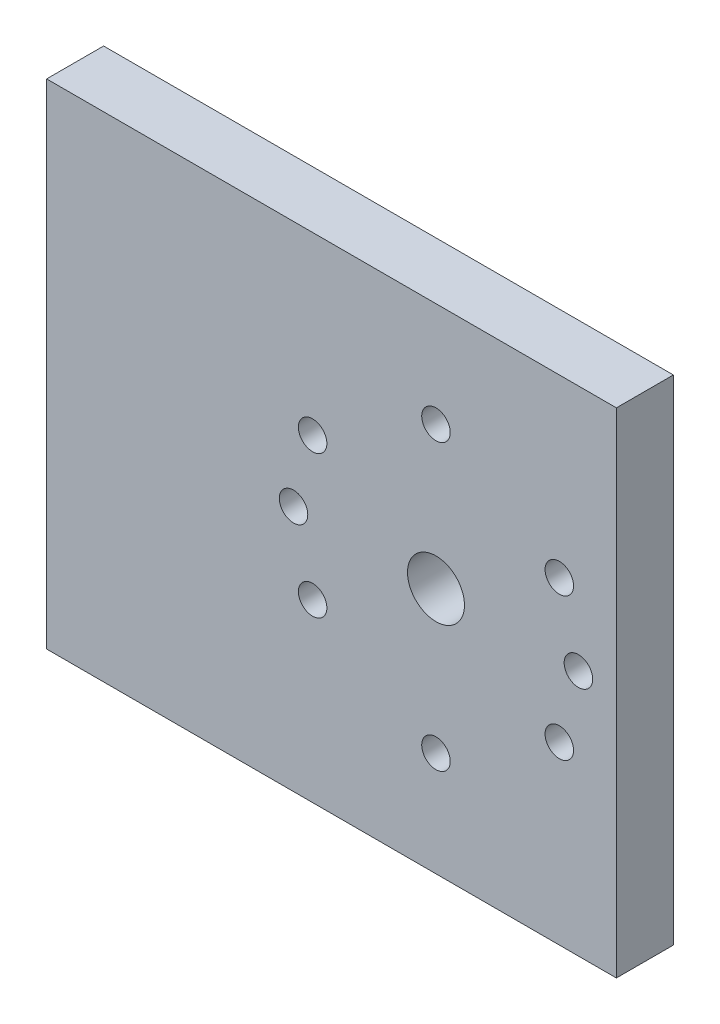
ISO-10303-21;
HEADER;
FILE_DESCRIPTION(('STEP AP214'),'2;1');
FILE_NAME('part.step','',(''),(''),'','','');
FILE_SCHEMA(('AUTOMOTIVE_DESIGN { 1 0 10303 214 1 1 1 1 }'));
ENDSEC;
DATA;
#1=APPLICATION_CONTEXT('core data for automotive mechanical design processes');
#2=APPLICATION_PROTOCOL_DEFINITION('international standard','automotive_design',2000,#1);
#3=PRODUCT_CONTEXT('',#1,'mechanical');
#4=PRODUCT('Part','Part','',(#3));
#5=PRODUCT_RELATED_PRODUCT_CATEGORY('part','',(#4));
#6=PRODUCT_DEFINITION_FORMATION('','',#4);
#7=PRODUCT_DEFINITION_CONTEXT('part definition',#1,'design');
#8=PRODUCT_DEFINITION('design','',#6,#7);
#9=PRODUCT_DEFINITION_SHAPE('','',#8);
#10=(LENGTH_UNIT() NAMED_UNIT(*) SI_UNIT(.MILLI.,.METRE.));
#11=(NAMED_UNIT(*) PLANE_ANGLE_UNIT() SI_UNIT($,.RADIAN.));
#12=(NAMED_UNIT(*) SI_UNIT($,.STERADIAN.) SOLID_ANGLE_UNIT());
#13=UNCERTAINTY_MEASURE_WITH_UNIT(LENGTH_MEASURE(1.E-05),#10,'distance_accuracy_value','');
#14=(GEOMETRIC_REPRESENTATION_CONTEXT(3) GLOBAL_UNCERTAINTY_ASSIGNED_CONTEXT((#13)) GLOBAL_UNIT_ASSIGNED_CONTEXT((#10,
#11,#12)) REPRESENTATION_CONTEXT('',''));
#15=CARTESIAN_POINT('',(0.,0.,0.));
#16=DIRECTION('',(0.,0.,1.));
#17=DIRECTION('',(1.,0.,0.));
#18=AXIS2_PLACEMENT_3D('',#15,#16,#17);
#19=CARTESIAN_POINT('',(0.,0.,3.));
#20=DIRECTION('',(0.,0.,1.));
#21=DIRECTION('',(1.,0.,0.));
#22=AXIS2_PLACEMENT_3D('',#19,#20,#21);
#23=PLANE('',#22);
#24=CARTESIAN_POINT('',(14.0048094716167,-16.7500000000001,3.));
#25=DIRECTION('',(0.,0.,1.));
#26=DIRECTION('',(1.,0.,0.));
#27=AXIS2_PLACEMENT_3D('',#24,#25,#26);
#28=CIRCLE('',#27,0.750000000000002);
#29=CARTESIAN_POINT('',(14.7548094716167,-16.7500000000001,3.));
#30=VERTEX_POINT('',#29);
#31=EDGE_CURVE('E151',#30,#30,#28,.T.);
#32=ORIENTED_EDGE('',*,*,#31,.F.);
#33=EDGE_LOOP('',(#32));
#34=FACE_BOUND('',#33,.T.);
#35=CARTESIAN_POINT('',(26.9951905283833,-16.7500000000001,3.));
#36=DIRECTION('',(0.,0.,1.));
#37=DIRECTION('',(1.,0.,0.));
#38=AXIS2_PLACEMENT_3D('',#35,#36,#37);
#39=CIRCLE('',#38,0.750000000000005);
#40=CARTESIAN_POINT('',(27.7451905283833,-16.7500000000001,3.));
#41=VERTEX_POINT('',#40);
#42=EDGE_CURVE('E139',#41,#41,#39,.T.);
#43=ORIENTED_EDGE('',*,*,#42,.F.);
#44=EDGE_LOOP('',(#43));
#45=FACE_BOUND('',#44,.T.);
#46=CARTESIAN_POINT('',(20.5,-13.0000000000001,3.));
#47=DIRECTION('',(0.,0.,1.));
#48=DIRECTION('',(1.,0.,0.));
#49=AXIS2_PLACEMENT_3D('',#46,#47,#48);
#50=CIRCLE('',#49,1.5);
#51=CARTESIAN_POINT('',(22.,-13.0000000000001,3.));
#52=VERTEX_POINT('',#51);
#53=EDGE_CURVE('E127',#52,#52,#50,.T.);
#54=ORIENTED_EDGE('',*,*,#53,.F.);
#55=EDGE_LOOP('',(#54));
#56=FACE_BOUND('',#55,.T.);
#57=CARTESIAN_POINT('',(28.,-13.0000000000001,3.));
#58=DIRECTION('',(0.,0.,1.));
#59=DIRECTION('',(1.,0.,0.));
#60=AXIS2_PLACEMENT_3D('',#57,#58,#59);
#61=CIRCLE('',#60,0.750000000000002);
#62=CARTESIAN_POINT('',(28.75,-13.0000000000001,3.));
#63=VERTEX_POINT('',#62);
#64=EDGE_CURVE('E115',#63,#63,#61,.T.);
#65=ORIENTED_EDGE('',*,*,#64,.F.);
#66=EDGE_LOOP('',(#65));
#67=FACE_BOUND('',#66,.T.);
#68=DIRECTION('',(0.,1.,0.));
#69=VECTOR('',#68,1.);
#70=CARTESIAN_POINT('',(30.,0.,3.));
#71=LINE('',#70,#69);
#72=CARTESIAN_POINT('',(30.,-26.,3.));
#73=VERTEX_POINT('',#72);
#74=CARTESIAN_POINT('',(30.,0.,3.));
#75=VERTEX_POINT('',#74);
#76=EDGE_CURVE('E85',#73,#75,#71,.T.);
#77=ORIENTED_EDGE('',*,*,#76,.T.);
#78=DIRECTION('',(-1.,0.,0.));
#79=VECTOR('',#78,1.);
#80=CARTESIAN_POINT('',(0.,0.,3.));
#81=LINE('',#80,#79);
#82=CARTESIAN_POINT('',(0.,0.,3.));
#83=VERTEX_POINT('',#82);
#84=EDGE_CURVE('E80',#75,#83,#81,.T.);
#85=ORIENTED_EDGE('',*,*,#84,.T.);
#86=DIRECTION('',(0.,-1.,0.));
#87=VECTOR('',#86,1.);
#88=CARTESIAN_POINT('',(0.,0.,3.));
#89=LINE('',#88,#87);
#90=CARTESIAN_POINT('',(0.,-26.0000000000002,3.));
#91=VERTEX_POINT('',#90);
#92=EDGE_CURVE('E83',#83,#91,#89,.T.);
#93=ORIENTED_EDGE('',*,*,#92,.T.);
#94=DIRECTION('',(1.,0.,0.));
#95=VECTOR('',#94,1.);
#96=CARTESIAN_POINT('',(0.,-26.0000000000002,3.));
#97=LINE('',#96,#95);
#98=EDGE_CURVE('E50',#91,#73,#97,.T.);
#99=ORIENTED_EDGE('',*,*,#98,.T.);
#100=EDGE_LOOP('',(#77,#85,#93,#99));
#101=FACE_BOUND('',#100,.T.);
#102=CARTESIAN_POINT('',(13.,-13.0000000000001,3.));
#103=DIRECTION('',(0.,0.,1.));
#104=DIRECTION('',(1.,0.,0.));
#105=AXIS2_PLACEMENT_3D('',#102,#103,#104);
#106=CIRCLE('',#105,0.75);
#107=CARTESIAN_POINT('',(13.75,-13.0000000000001,3.));
#108=VERTEX_POINT('',#107);
#109=EDGE_CURVE('E100',#108,#108,#106,.T.);
#110=ORIENTED_EDGE('',*,*,#109,.F.);
#111=EDGE_LOOP('',(#110));
#112=FACE_BOUND('',#111,.T.);
#113=CARTESIAN_POINT('',(20.5,-5.50000000000007,3.));
#114=DIRECTION('',(0.,0.,1.));
#115=DIRECTION('',(1.,0.,0.));
#116=AXIS2_PLACEMENT_3D('',#113,#114,#115);
#117=CIRCLE('',#116,0.750000000000002);
#118=CARTESIAN_POINT('',(21.25,-5.50000000000007,3.));
#119=VERTEX_POINT('',#118);
#120=EDGE_CURVE('E121',#119,#119,#117,.T.);
#121=ORIENTED_EDGE('',*,*,#120,.F.);
#122=EDGE_LOOP('',(#121));
#123=FACE_BOUND('',#122,.T.);
#124=CARTESIAN_POINT('',(26.9951905283833,-9.25000000000007,3.));
#125=DIRECTION('',(0.,0.,1.));
#126=DIRECTION('',(1.,0.,0.));
#127=AXIS2_PLACEMENT_3D('',#124,#125,#126);
#128=CIRCLE('',#127,0.750000000000002);
#129=CARTESIAN_POINT('',(27.7451905283833,-9.25000000000007,3.));
#130=VERTEX_POINT('',#129);
#131=EDGE_CURVE('E133',#130,#130,#128,.T.);
#132=ORIENTED_EDGE('',*,*,#131,.F.);
#133=EDGE_LOOP('',(#132));
#134=FACE_BOUND('',#133,.T.);
#135=CARTESIAN_POINT('',(20.5,-20.5000000000001,3.));
#136=DIRECTION('',(0.,0.,1.));
#137=DIRECTION('',(1.,0.,0.));
#138=AXIS2_PLACEMENT_3D('',#135,#136,#137);
#139=CIRCLE('',#138,0.750000000000002);
#140=CARTESIAN_POINT('',(21.25,-20.5000000000001,3.));
#141=VERTEX_POINT('',#140);
#142=EDGE_CURVE('E145',#141,#141,#139,.T.);
#143=ORIENTED_EDGE('',*,*,#142,.F.);
#144=EDGE_LOOP('',(#143));
#145=FACE_BOUND('',#144,.T.);
#146=CARTESIAN_POINT('',(14.0048094716167,-9.25000000000008,3.));
#147=DIRECTION('',(0.,0.,1.));
#148=DIRECTION('',(1.,0.,0.));
#149=AXIS2_PLACEMENT_3D('',#146,#147,#148);
#150=CIRCLE('',#149,0.750000000000002);
#151=CARTESIAN_POINT('',(14.7548094716167,-9.25000000000008,3.));
#152=VERTEX_POINT('',#151);
#153=EDGE_CURVE('E157',#152,#152,#150,.T.);
#154=ORIENTED_EDGE('',*,*,#153,.F.);
#155=EDGE_LOOP('',(#154));
#156=FACE_BOUND('',#155,.T.);
#157=ADVANCED_FACE('F33',(#34,#45,#56,#67,#101,#112,#123,#134,#145,#156),#23,.T.);
#158=CARTESIAN_POINT('',(0.,0.,0.));
#159=DIRECTION('',(0.,0.,1.));
#160=DIRECTION('',(1.,0.,0.));
#161=AXIS2_PLACEMENT_3D('',#158,#159,#160);
#162=PLANE('',#161);
#163=DIRECTION('',(0.,1.,0.));
#164=VECTOR('',#163,1.);
#165=CARTESIAN_POINT('',(30.,0.,0.));
#166=LINE('',#165,#164);
#167=CARTESIAN_POINT('',(30.,-26.,0.));
#168=VERTEX_POINT('',#167);
#169=CARTESIAN_POINT('',(30.,0.,0.));
#170=VERTEX_POINT('',#169);
#171=EDGE_CURVE('E97',#168,#170,#166,.T.);
#172=ORIENTED_EDGE('',*,*,#171,.F.);
#173=DIRECTION('',(1.,0.,0.));
#174=VECTOR('',#173,1.);
#175=CARTESIAN_POINT('',(0.,-26.0000000000002,0.));
#176=LINE('',#175,#174);
#177=CARTESIAN_POINT('',(0.,-26.0000000000002,0.));
#178=VERTEX_POINT('',#177);
#179=EDGE_CURVE('E73',#178,#168,#176,.T.);
#180=ORIENTED_EDGE('',*,*,#179,.F.);
#181=DIRECTION('',(0.,-1.,0.));
#182=VECTOR('',#181,1.);
#183=CARTESIAN_POINT('',(0.,0.,0.));
#184=LINE('',#183,#182);
#185=CARTESIAN_POINT('',(0.,0.,0.));
#186=VERTEX_POINT('',#185);
#187=EDGE_CURVE('E67',#186,#178,#184,.T.);
#188=ORIENTED_EDGE('',*,*,#187,.F.);
#189=DIRECTION('',(-1.,0.,0.));
#190=VECTOR('',#189,1.);
#191=CARTESIAN_POINT('',(0.,0.,0.));
#192=LINE('',#191,#190);
#193=EDGE_CURVE('E89',#170,#186,#192,.T.);
#194=ORIENTED_EDGE('',*,*,#193,.F.);
#195=EDGE_LOOP('',(#172,#180,#188,#194));
#196=FACE_BOUND('',#195,.T.);
#197=CARTESIAN_POINT('',(13.,-13.0000000000001,0.));
#198=DIRECTION('',(0.,0.,1.));
#199=DIRECTION('',(1.,0.,0.));
#200=AXIS2_PLACEMENT_3D('',#197,#198,#199);
#201=CIRCLE('',#200,0.75);
#202=CARTESIAN_POINT('',(13.75,-13.0000000000001,0.));
#203=VERTEX_POINT('',#202);
#204=EDGE_CURVE('E112',#203,#203,#201,.T.);
#205=ORIENTED_EDGE('',*,*,#204,.T.);
#206=EDGE_LOOP('',(#205));
#207=FACE_BOUND('',#206,.T.);
#208=CARTESIAN_POINT('',(28.,-13.0000000000001,0.));
#209=DIRECTION('',(0.,0.,1.));
#210=DIRECTION('',(1.,0.,0.));
#211=AXIS2_PLACEMENT_3D('',#208,#209,#210);
#212=CIRCLE('',#211,0.750000000000002);
#213=CARTESIAN_POINT('',(28.75,-13.0000000000001,0.));
#214=VERTEX_POINT('',#213);
#215=EDGE_CURVE('E118',#214,#214,#212,.T.);
#216=ORIENTED_EDGE('',*,*,#215,.T.);
#217=EDGE_LOOP('',(#216));
#218=FACE_BOUND('',#217,.T.);
#219=CARTESIAN_POINT('',(20.5,-5.50000000000007,0.));
#220=DIRECTION('',(0.,0.,1.));
#221=DIRECTION('',(1.,0.,0.));
#222=AXIS2_PLACEMENT_3D('',#219,#220,#221);
#223=CIRCLE('',#222,0.750000000000002);
#224=CARTESIAN_POINT('',(21.25,-5.50000000000007,0.));
#225=VERTEX_POINT('',#224);
#226=EDGE_CURVE('E124',#225,#225,#223,.T.);
#227=ORIENTED_EDGE('',*,*,#226,.T.);
#228=EDGE_LOOP('',(#227));
#229=FACE_BOUND('',#228,.T.);
#230=CARTESIAN_POINT('',(20.5,-13.0000000000001,0.));
#231=DIRECTION('',(0.,0.,1.));
#232=DIRECTION('',(1.,0.,0.));
#233=AXIS2_PLACEMENT_3D('',#230,#231,#232);
#234=CIRCLE('',#233,1.5);
#235=CARTESIAN_POINT('',(22.,-13.0000000000001,0.));
#236=VERTEX_POINT('',#235);
#237=EDGE_CURVE('E130',#236,#236,#234,.T.);
#238=ORIENTED_EDGE('',*,*,#237,.T.);
#239=EDGE_LOOP('',(#238));
#240=FACE_BOUND('',#239,.T.);
#241=CARTESIAN_POINT('',(26.9951905283833,-9.25000000000007,0.));
#242=DIRECTION('',(0.,0.,1.));
#243=DIRECTION('',(1.,0.,0.));
#244=AXIS2_PLACEMENT_3D('',#241,#242,#243);
#245=CIRCLE('',#244,0.750000000000002);
#246=CARTESIAN_POINT('',(27.7451905283833,-9.25000000000007,0.));
#247=VERTEX_POINT('',#246);
#248=EDGE_CURVE('E136',#247,#247,#245,.T.);
#249=ORIENTED_EDGE('',*,*,#248,.T.);
#250=EDGE_LOOP('',(#249));
#251=FACE_BOUND('',#250,.T.);
#252=CARTESIAN_POINT('',(26.9951905283833,-16.7500000000001,0.));
#253=DIRECTION('',(0.,0.,1.));
#254=DIRECTION('',(1.,0.,0.));
#255=AXIS2_PLACEMENT_3D('',#252,#253,#254);
#256=CIRCLE('',#255,0.750000000000005);
#257=CARTESIAN_POINT('',(27.7451905283833,-16.7500000000001,0.));
#258=VERTEX_POINT('',#257);
#259=EDGE_CURVE('E142',#258,#258,#256,.T.);
#260=ORIENTED_EDGE('',*,*,#259,.T.);
#261=EDGE_LOOP('',(#260));
#262=FACE_BOUND('',#261,.T.);
#263=CARTESIAN_POINT('',(20.5,-20.5000000000001,0.));
#264=DIRECTION('',(0.,0.,1.));
#265=DIRECTION('',(1.,0.,0.));
#266=AXIS2_PLACEMENT_3D('',#263,#264,#265);
#267=CIRCLE('',#266,0.750000000000002);
#268=CARTESIAN_POINT('',(21.25,-20.5000000000001,0.));
#269=VERTEX_POINT('',#268);
#270=EDGE_CURVE('E148',#269,#269,#267,.T.);
#271=ORIENTED_EDGE('',*,*,#270,.T.);
#272=EDGE_LOOP('',(#271));
#273=FACE_BOUND('',#272,.T.);
#274=CARTESIAN_POINT('',(14.0048094716167,-16.7500000000001,0.));
#275=DIRECTION('',(0.,0.,1.));
#276=DIRECTION('',(1.,0.,0.));
#277=AXIS2_PLACEMENT_3D('',#274,#275,#276);
#278=CIRCLE('',#277,0.750000000000002);
#279=CARTESIAN_POINT('',(14.7548094716167,-16.7500000000001,0.));
#280=VERTEX_POINT('',#279);
#281=EDGE_CURVE('E154',#280,#280,#278,.T.);
#282=ORIENTED_EDGE('',*,*,#281,.T.);
#283=EDGE_LOOP('',(#282));
#284=FACE_BOUND('',#283,.T.);
#285=CARTESIAN_POINT('',(14.0048094716167,-9.25000000000008,0.));
#286=DIRECTION('',(0.,0.,1.));
#287=DIRECTION('',(1.,0.,0.));
#288=AXIS2_PLACEMENT_3D('',#285,#286,#287);
#289=CIRCLE('',#288,0.750000000000002);
#290=CARTESIAN_POINT('',(14.7548094716167,-9.25000000000008,0.));
#291=VERTEX_POINT('',#290);
#292=EDGE_CURVE('E160',#291,#291,#289,.T.);
#293=ORIENTED_EDGE('',*,*,#292,.T.);
#294=EDGE_LOOP('',(#293));
#295=FACE_BOUND('',#294,.T.);
#296=ADVANCED_FACE('F108',(#196,#207,#218,#229,#240,#251,#262,#273,#284,#295),#162,.F.);
#297=CARTESIAN_POINT('',(30.,0.,3.));
#298=DIRECTION('',(-1.,0.,0.));
#299=DIRECTION('',(0.,-1.,0.));
#300=AXIS2_PLACEMENT_3D('',#297,#298,#299);
#301=PLANE('',#300);
#302=ORIENTED_EDGE('',*,*,#171,.T.);
#303=DIRECTION('',(0.,0.,-1.));
#304=VECTOR('',#303,1.);
#305=CARTESIAN_POINT('',(30.,0.,3.));
#306=LINE('',#305,#304);
#307=EDGE_CURVE('E11',#75,#170,#306,.T.);
#308=ORIENTED_EDGE('',*,*,#307,.F.);
#309=ORIENTED_EDGE('',*,*,#76,.F.);
#310=DIRECTION('',(0.,0.,-1.));
#311=VECTOR('',#310,1.);
#312=CARTESIAN_POINT('',(30.,-26.,3.));
#313=LINE('',#312,#311);
#314=EDGE_CURVE('E93',#73,#168,#313,.T.);
#315=ORIENTED_EDGE('',*,*,#314,.T.);
#316=EDGE_LOOP('',(#302,#308,#309,#315));
#317=FACE_BOUND('',#316,.T.);
#318=ADVANCED_FACE('F35',(#317),#301,.F.);
#319=CARTESIAN_POINT('',(0.,0.,3.));
#320=DIRECTION('',(0.,-1.,0.));
#321=DIRECTION('',(1.,0.,0.));
#322=AXIS2_PLACEMENT_3D('',#319,#320,#321);
#323=PLANE('',#322);
#324=ORIENTED_EDGE('',*,*,#193,.T.);
#325=DIRECTION('',(0.,0.,-1.));
#326=VECTOR('',#325,1.);
#327=CARTESIAN_POINT('',(0.,0.,3.));
#328=LINE('',#327,#326);
#329=EDGE_CURVE('E42',#83,#186,#328,.T.);
#330=ORIENTED_EDGE('',*,*,#329,.F.);
#331=ORIENTED_EDGE('',*,*,#84,.F.);
#332=ORIENTED_EDGE('',*,*,#307,.T.);
#333=EDGE_LOOP('',(#324,#330,#331,#332));
#334=FACE_BOUND('',#333,.T.);
#335=ADVANCED_FACE('F88',(#334),#323,.F.);
#336=CARTESIAN_POINT('',(0.,0.,3.));
#337=DIRECTION('',(1.,0.,0.));
#338=DIRECTION('',(0.,1.,0.));
#339=AXIS2_PLACEMENT_3D('',#336,#337,#338);
#340=PLANE('',#339);
#341=ORIENTED_EDGE('',*,*,#187,.T.);
#342=DIRECTION('',(0.,0.,-1.));
#343=VECTOR('',#342,1.);
#344=CARTESIAN_POINT('',(0.,-26.0000000000002,3.));
#345=LINE('',#344,#343);
#346=EDGE_CURVE('E90',#91,#178,#345,.T.);
#347=ORIENTED_EDGE('',*,*,#346,.F.);
#348=ORIENTED_EDGE('',*,*,#92,.F.);
#349=ORIENTED_EDGE('',*,*,#329,.T.);
#350=EDGE_LOOP('',(#341,#347,#348,#349));
#351=FACE_BOUND('',#350,.T.);
#352=ADVANCED_FACE('F91',(#351),#340,.F.);
#353=CARTESIAN_POINT('',(0.,-26.0000000000002,3.));
#354=DIRECTION('',(0.,1.,0.));
#355=DIRECTION('',(-1.,0.,0.));
#356=AXIS2_PLACEMENT_3D('',#353,#354,#355);
#357=PLANE('',#356);
#358=ORIENTED_EDGE('',*,*,#179,.T.);
#359=ORIENTED_EDGE('',*,*,#314,.F.);
#360=ORIENTED_EDGE('',*,*,#98,.F.);
#361=ORIENTED_EDGE('',*,*,#346,.T.);
#362=EDGE_LOOP('',(#358,#359,#360,#361));
#363=FACE_BOUND('',#362,.T.);
#364=ADVANCED_FACE('F105',(#363),#357,.F.);
#365=CARTESIAN_POINT('',(13.,-13.0000000000001,3.));
#366=DIRECTION('',(0.,0.,-1.));
#367=DIRECTION('',(-1.,0.,0.));
#368=AXIS2_PLACEMENT_3D('',#365,#366,#367);
#369=CYLINDRICAL_SURFACE('',#368,0.75);
#370=ORIENTED_EDGE('',*,*,#109,.T.);
#371=EDGE_LOOP('',(#370));
#372=FACE_BOUND('',#371,.T.);
#373=ORIENTED_EDGE('',*,*,#204,.F.);
#374=EDGE_LOOP('',(#373));
#375=FACE_BOUND('',#374,.T.);
#376=ADVANCED_FACE('F179',(#372,#375),#369,.F.);
#377=CARTESIAN_POINT('',(28.,-13.0000000000001,3.));
#378=DIRECTION('',(0.,0.,-1.));
#379=DIRECTION('',(-1.,0.,0.));
#380=AXIS2_PLACEMENT_3D('',#377,#378,#379);
#381=CYLINDRICAL_SURFACE('',#380,0.750000000000002);
#382=ORIENTED_EDGE('',*,*,#64,.T.);
#383=EDGE_LOOP('',(#382));
#384=FACE_BOUND('',#383,.T.);
#385=ORIENTED_EDGE('',*,*,#215,.F.);
#386=EDGE_LOOP('',(#385));
#387=FACE_BOUND('',#386,.T.);
#388=ADVANCED_FACE('F225',(#384,#387),#381,.F.);
#389=CARTESIAN_POINT('',(20.5,-5.50000000000007,3.));
#390=DIRECTION('',(0.,0.,-1.));
#391=DIRECTION('',(-1.,0.,0.));
#392=AXIS2_PLACEMENT_3D('',#389,#390,#391);
#393=CYLINDRICAL_SURFACE('',#392,0.750000000000002);
#394=ORIENTED_EDGE('',*,*,#120,.T.);
#395=EDGE_LOOP('',(#394));
#396=FACE_BOUND('',#395,.T.);
#397=ORIENTED_EDGE('',*,*,#226,.F.);
#398=EDGE_LOOP('',(#397));
#399=FACE_BOUND('',#398,.T.);
#400=ADVANCED_FACE('F233',(#396,#399),#393,.F.);
#401=CARTESIAN_POINT('',(20.5,-13.0000000000001,3.));
#402=DIRECTION('',(0.,0.,-1.));
#403=DIRECTION('',(-1.,0.,0.));
#404=AXIS2_PLACEMENT_3D('',#401,#402,#403);
#405=CYLINDRICAL_SURFACE('',#404,1.5);
#406=ORIENTED_EDGE('',*,*,#53,.T.);
#407=EDGE_LOOP('',(#406));
#408=FACE_BOUND('',#407,.T.);
#409=ORIENTED_EDGE('',*,*,#237,.F.);
#410=EDGE_LOOP('',(#409));
#411=FACE_BOUND('',#410,.T.);
#412=ADVANCED_FACE('F241',(#408,#411),#405,.F.);
#413=CARTESIAN_POINT('',(26.9951905283833,-9.25000000000007,3.));
#414=DIRECTION('',(0.,0.,-1.));
#415=DIRECTION('',(-1.,0.,0.));
#416=AXIS2_PLACEMENT_3D('',#413,#414,#415);
#417=CYLINDRICAL_SURFACE('',#416,0.750000000000002);
#418=ORIENTED_EDGE('',*,*,#131,.T.);
#419=EDGE_LOOP('',(#418));
#420=FACE_BOUND('',#419,.T.);
#421=ORIENTED_EDGE('',*,*,#248,.F.);
#422=EDGE_LOOP('',(#421));
#423=FACE_BOUND('',#422,.T.);
#424=ADVANCED_FACE('F250',(#420,#423),#417,.F.);
#425=CARTESIAN_POINT('',(26.9951905283833,-16.7500000000001,3.));
#426=DIRECTION('',(0.,0.,-1.));
#427=DIRECTION('',(-1.,0.,0.));
#428=AXIS2_PLACEMENT_3D('',#425,#426,#427);
#429=CYLINDRICAL_SURFACE('',#428,0.750000000000005);
#430=ORIENTED_EDGE('',*,*,#42,.T.);
#431=EDGE_LOOP('',(#430));
#432=FACE_BOUND('',#431,.T.);
#433=ORIENTED_EDGE('',*,*,#259,.F.);
#434=EDGE_LOOP('',(#433));
#435=FACE_BOUND('',#434,.T.);
#436=ADVANCED_FACE('F259',(#432,#435),#429,.F.);
#437=CARTESIAN_POINT('',(20.5,-20.5000000000001,3.));
#438=DIRECTION('',(0.,0.,-1.));
#439=DIRECTION('',(-1.,0.,0.));
#440=AXIS2_PLACEMENT_3D('',#437,#438,#439);
#441=CYLINDRICAL_SURFACE('',#440,0.750000000000002);
#442=ORIENTED_EDGE('',*,*,#142,.T.);
#443=EDGE_LOOP('',(#442));
#444=FACE_BOUND('',#443,.T.);
#445=ORIENTED_EDGE('',*,*,#270,.F.);
#446=EDGE_LOOP('',(#445));
#447=FACE_BOUND('',#446,.T.);
#448=ADVANCED_FACE('F268',(#444,#447),#441,.F.);
#449=CARTESIAN_POINT('',(14.0048094716167,-16.7500000000001,3.));
#450=DIRECTION('',(0.,0.,-1.));
#451=DIRECTION('',(-1.,0.,0.));
#452=AXIS2_PLACEMENT_3D('',#449,#450,#451);
#453=CYLINDRICAL_SURFACE('',#452,0.750000000000002);
#454=ORIENTED_EDGE('',*,*,#31,.T.);
#455=EDGE_LOOP('',(#454));
#456=FACE_BOUND('',#455,.T.);
#457=ORIENTED_EDGE('',*,*,#281,.F.);
#458=EDGE_LOOP('',(#457));
#459=FACE_BOUND('',#458,.T.);
#460=ADVANCED_FACE('F277',(#456,#459),#453,.F.);
#461=CARTESIAN_POINT('',(14.0048094716167,-9.25000000000008,3.));
#462=DIRECTION('',(0.,0.,-1.));
#463=DIRECTION('',(-1.,0.,0.));
#464=AXIS2_PLACEMENT_3D('',#461,#462,#463);
#465=CYLINDRICAL_SURFACE('',#464,0.750000000000002);
#466=ORIENTED_EDGE('',*,*,#153,.T.);
#467=EDGE_LOOP('',(#466));
#468=FACE_BOUND('',#467,.T.);
#469=ORIENTED_EDGE('',*,*,#292,.F.);
#470=EDGE_LOOP('',(#469));
#471=FACE_BOUND('',#470,.T.);
#472=ADVANCED_FACE('F166',(#468,#471),#465,.F.);
#473=CLOSED_SHELL('',(#157,#296,#318,#335,#352,#364,#376,#388,#400,#412,#424,#436,#448,#460,#472));
#474=MANIFOLD_SOLID_BREP('B2',#473);
#475=ADVANCED_BREP_SHAPE_REPRESENTATION('',(#18,#474),#14);
#476=SHAPE_DEFINITION_REPRESENTATION(#9,#475);
ENDSEC;
END-ISO-10303-21;
